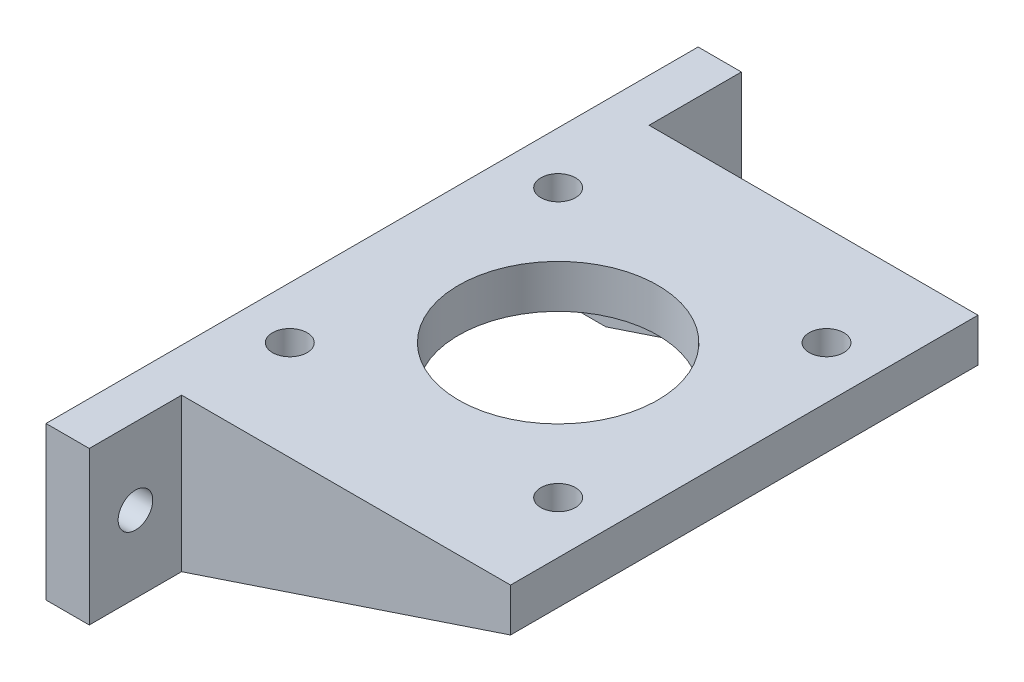
ISO-10303-21;
HEADER;
FILE_DESCRIPTION(('STEP AP214'),'2;1');
FILE_NAME('part.step','',(''),(''),'','','');
FILE_SCHEMA(('AUTOMOTIVE_DESIGN { 1 0 10303 214 1 1 1 1 }'));
ENDSEC;
DATA;
#1=APPLICATION_CONTEXT('core data for automotive mechanical design processes');
#2=APPLICATION_PROTOCOL_DEFINITION('international standard','automotive_design',2000,#1);
#3=PRODUCT_CONTEXT('',#1,'mechanical');
#4=PRODUCT('Part','Part','',(#3));
#5=PRODUCT_RELATED_PRODUCT_CATEGORY('part','',(#4));
#6=PRODUCT_DEFINITION_FORMATION('','',#4);
#7=PRODUCT_DEFINITION_CONTEXT('part definition',#1,'design');
#8=PRODUCT_DEFINITION('design','',#6,#7);
#9=PRODUCT_DEFINITION_SHAPE('','',#8);
#10=(LENGTH_UNIT() NAMED_UNIT(*) SI_UNIT(.MILLI.,.METRE.));
#11=(NAMED_UNIT(*) PLANE_ANGLE_UNIT() SI_UNIT($,.RADIAN.));
#12=(NAMED_UNIT(*) SI_UNIT($,.STERADIAN.) SOLID_ANGLE_UNIT());
#13=UNCERTAINTY_MEASURE_WITH_UNIT(LENGTH_MEASURE(1.E-05),#10,'distance_accuracy_value','');
#14=(GEOMETRIC_REPRESENTATION_CONTEXT(3) GLOBAL_UNCERTAINTY_ASSIGNED_CONTEXT((#13)) GLOBAL_UNIT_ASSIGNED_CONTEXT((#10,
#11,#12)) REPRESENTATION_CONTEXT('',''));
#15=CARTESIAN_POINT('',(0.,0.,0.));
#16=DIRECTION('',(0.,0.,1.));
#17=DIRECTION('',(1.,0.,0.));
#18=AXIS2_PLACEMENT_3D('',#15,#16,#17);
#19=CARTESIAN_POINT('',(0.,0.,5.));
#20=DIRECTION('',(0.,0.,1.));
#21=DIRECTION('',(1.,0.,0.));
#22=AXIS2_PLACEMENT_3D('',#19,#20,#21);
#23=PLANE('',#22);
#24=DIRECTION('',(1.,0.,0.));
#25=VECTOR('',#24,1.);
#26=CARTESIAN_POINT('',(0.,5.,5.));
#27=LINE('',#26,#25);
#28=CARTESIAN_POINT('',(5.,5.,5.));
#29=VERTEX_POINT('',#28);
#30=CARTESIAN_POINT('',(43.,5.,5.));
#31=VERTEX_POINT('',#30);
#32=EDGE_CURVE('E209',#29,#31,#27,.T.);
#33=ORIENTED_EDGE('',*,*,#32,.F.);
#34=DIRECTION('',(0.,-1.,0.));
#35=VECTOR('',#34,1.);
#36=CARTESIAN_POINT('',(5.,5.,5.));
#37=LINE('',#36,#35);
#38=CARTESIAN_POINT('',(5.,-12.666,5.));
#39=VERTEX_POINT('',#38);
#40=EDGE_CURVE('E172',#29,#39,#37,.T.);
#41=ORIENTED_EDGE('',*,*,#40,.T.);
#42=DIRECTION('',(0.948688291028524,0.316212786688613,0.));
#43=VECTOR('',#42,1.);
#44=CARTESIAN_POINT('',(4.29959263801126,-12.8994568328145,5.));
#45=LINE('',#44,#43);
#46=CARTESIAN_POINT('',(43.,0.,5.));
#47=VERTEX_POINT('',#46);
#48=EDGE_CURVE('E206',#39,#47,#45,.T.);
#49=ORIENTED_EDGE('',*,*,#48,.T.);
#50=DIRECTION('',(0.,-1.,0.));
#51=VECTOR('',#50,1.);
#52=CARTESIAN_POINT('',(43.,0.,5.));
#53=LINE('',#52,#51);
#54=EDGE_CURVE('E230',#31,#47,#53,.T.);
#55=ORIENTED_EDGE('',*,*,#54,.F.);
#56=EDGE_LOOP('',(#33,#41,#49,#55));
#57=FACE_BOUND('',#56,.T.);
#58=ADVANCED_FACE('F35',(#57),#23,.T.);
#59=CARTESIAN_POINT('',(0.,0.,-44.));
#60=DIRECTION('',(0.,-1.,0.));
#61=DIRECTION('',(0.,0.,-1.));
#62=AXIS2_PLACEMENT_3D('',#59,#60,#61);
#63=PLANE('',#62);
#64=CARTESIAN_POINT('',(37.0000000000003,0.,-6.5));
#65=DIRECTION('',(0.,1.,0.));
#66=DIRECTION('',(0.,0.,1.));
#67=AXIS2_PLACEMENT_3D('',#64,#65,#66);
#68=CIRCLE('',#67,2.);
#69=CARTESIAN_POINT('',(37.0000000000003,0.,-4.5));
#70=VERTEX_POINT('',#69);
#71=EDGE_CURVE('E250',#70,#70,#68,.T.);
#72=ORIENTED_EDGE('',*,*,#71,.T.);
#73=EDGE_LOOP('',(#72));
#74=FACE_BOUND('',#73,.T.);
#75=CARTESIAN_POINT('',(6.00000000000032,0.,-6.49999999999978));
#76=DIRECTION('',(0.,1.,0.));
#77=DIRECTION('',(0.,0.,1.));
#78=AXIS2_PLACEMENT_3D('',#75,#76,#77);
#79=CIRCLE('',#78,2.);
#80=CARTESIAN_POINT('',(6.00000000000032,0.,-4.49999999999978));
#81=VERTEX_POINT('',#80);
#82=EDGE_CURVE('E257',#81,#81,#79,.T.);
#83=ORIENTED_EDGE('',*,*,#82,.T.);
#84=EDGE_LOOP('',(#83));
#85=FACE_BOUND('',#84,.T.);
#86=CARTESIAN_POINT('',(6.,0.,-37.4999999999998));
#87=DIRECTION('',(0.,1.,0.));
#88=DIRECTION('',(0.,0.,1.));
#89=AXIS2_PLACEMENT_3D('',#86,#87,#88);
#90=CIRCLE('',#89,2.);
#91=CARTESIAN_POINT('',(6.,0.,-35.4999999999998));
#92=VERTEX_POINT('',#91);
#93=EDGE_CURVE('E263',#92,#92,#90,.T.);
#94=ORIENTED_EDGE('',*,*,#93,.T.);
#95=EDGE_LOOP('',(#94));
#96=FACE_BOUND('',#95,.T.);
#97=CARTESIAN_POINT('',(37.,0.,-37.5));
#98=DIRECTION('',(0.,1.,0.));
#99=DIRECTION('',(0.,0.,1.));
#100=AXIS2_PLACEMENT_3D('',#97,#98,#99);
#101=CIRCLE('',#100,2.);
#102=CARTESIAN_POINT('',(37.,0.,-35.5));
#103=VERTEX_POINT('',#102);
#104=EDGE_CURVE('E269',#103,#103,#101,.T.);
#105=ORIENTED_EDGE('',*,*,#104,.T.);
#106=EDGE_LOOP('',(#105));
#107=FACE_BOUND('',#106,.T.);
#108=CARTESIAN_POINT('',(21.5,0.,-22.));
#109=DIRECTION('',(0.,1.,0.));
#110=DIRECTION('',(0.,0.,1.));
#111=AXIS2_PLACEMENT_3D('',#108,#109,#110);
#112=CIRCLE('',#111,11.5);
#113=CARTESIAN_POINT('',(21.5,0.,-10.5));
#114=VERTEX_POINT('',#113);
#115=EDGE_CURVE('E275',#114,#114,#112,.T.);
#116=ORIENTED_EDGE('',*,*,#115,.T.);
#117=EDGE_LOOP('',(#116));
#118=FACE_BOUND('',#117,.T.);
#119=DIRECTION('',(1.,0.,0.));
#120=VECTOR('',#119,1.);
#121=CARTESIAN_POINT('',(0.,0.,0.));
#122=LINE('',#121,#120);
#123=CARTESIAN_POINT('',(0.,0.,0.));
#124=VERTEX_POINT('',#123);
#125=CARTESIAN_POINT('',(43.,0.,0.));
#126=VERTEX_POINT('',#125);
#127=EDGE_CURVE('E278',#124,#126,#122,.T.);
#128=ORIENTED_EDGE('',*,*,#127,.F.);
#129=DIRECTION('',(0.,0.,1.));
#130=VECTOR('',#129,1.);
#131=CARTESIAN_POINT('',(0.,0.,-44.));
#132=LINE('',#131,#130);
#133=CARTESIAN_POINT('',(0.,0.,-44.));
#134=VERTEX_POINT('',#133);
#135=EDGE_CURVE('E11',#134,#124,#132,.T.);
#136=ORIENTED_EDGE('',*,*,#135,.F.);
#137=DIRECTION('',(1.,0.,0.));
#138=VECTOR('',#137,1.);
#139=CARTESIAN_POINT('',(0.,0.,-44.));
#140=LINE('',#139,#138);
#141=CARTESIAN_POINT('',(43.,0.,-44.));
#142=VERTEX_POINT('',#141);
#143=EDGE_CURVE('E285',#134,#142,#140,.T.);
#144=ORIENTED_EDGE('',*,*,#143,.T.);
#145=DIRECTION('',(0.,0.,1.));
#146=VECTOR('',#145,1.);
#147=CARTESIAN_POINT('',(43.,0.,-44.));
#148=LINE('',#147,#146);
#149=EDGE_CURVE('E284',#142,#126,#148,.T.);
#150=ORIENTED_EDGE('',*,*,#149,.T.);
#151=EDGE_LOOP('',(#128,#136,#144,#150));
#152=FACE_BOUND('',#151,.T.);
#153=ADVANCED_FACE('F37',(#74,#85,#96,#107,#118,#152),#63,.T.);
#154=CARTESIAN_POINT('',(0.,0.,-44.));
#155=DIRECTION('',(1.,0.,0.));
#156=DIRECTION('',(0.,0.,-1.));
#157=AXIS2_PLACEMENT_3D('',#154,#155,#156);
#158=PLANE('',#157);
#159=ORIENTED_EDGE('',*,*,#135,.T.);
#160=DIRECTION('',(0.,1.,0.));
#161=VECTOR('',#160,1.);
#162=CARTESIAN_POINT('',(0.,0.,0.));
#163=LINE('',#162,#161);
#164=CARTESIAN_POINT('',(0.,-12.666,0.));
#165=VERTEX_POINT('',#164);
#166=EDGE_CURVE('E244',#165,#124,#163,.T.);
#167=ORIENTED_EDGE('',*,*,#166,.F.);
#168=DIRECTION('',(0.,0.,-1.));
#169=VECTOR('',#168,1.);
#170=CARTESIAN_POINT('',(0.,-12.666,5.));
#171=LINE('',#170,#169);
#172=CARTESIAN_POINT('',(0.,-12.666,15.666));
#173=VERTEX_POINT('',#172);
#174=EDGE_CURVE('E248',#173,#165,#171,.T.);
#175=ORIENTED_EDGE('',*,*,#174,.F.);
#176=DIRECTION('',(0.,1.,0.));
#177=VECTOR('',#176,1.);
#178=CARTESIAN_POINT('',(0.,5.00000000000001,15.666));
#179=LINE('',#178,#177);
#180=CARTESIAN_POINT('',(0.,5.00000000000001,15.666));
#181=VERTEX_POINT('',#180);
#182=EDGE_CURVE('E165',#173,#181,#179,.T.);
#183=ORIENTED_EDGE('',*,*,#182,.T.);
#184=DIRECTION('',(0.,0.,1.));
#185=VECTOR('',#184,1.);
#186=CARTESIAN_POINT('',(0.,5.,-44.));
#187=LINE('',#186,#185);
#188=CARTESIAN_POINT('',(0.,5.,-59.666));
#189=VERTEX_POINT('',#188);
#190=EDGE_CURVE('E44',#189,#181,#187,.T.);
#191=ORIENTED_EDGE('',*,*,#190,.F.);
#192=DIRECTION('',(0.,-1.,0.));
#193=VECTOR('',#192,1.);
#194=CARTESIAN_POINT('',(0.,5.,-59.666));
#195=LINE('',#194,#193);
#196=CARTESIAN_POINT('',(0.,-12.666,-59.666));
#197=VERTEX_POINT('',#196);
#198=EDGE_CURVE('E134',#189,#197,#195,.T.);
#199=ORIENTED_EDGE('',*,*,#198,.T.);
#200=DIRECTION('',(0.,0.,1.));
#201=VECTOR('',#200,1.);
#202=CARTESIAN_POINT('',(0.,-12.666,-49.));
#203=LINE('',#202,#201);
#204=CARTESIAN_POINT('',(0.,-12.666,-44.));
#205=VERTEX_POINT('',#204);
#206=EDGE_CURVE('E197',#197,#205,#203,.T.);
#207=ORIENTED_EDGE('',*,*,#206,.T.);
#208=DIRECTION('',(0.,1.,0.));
#209=VECTOR('',#208,1.);
#210=CARTESIAN_POINT('',(0.,0.,-44.));
#211=LINE('',#210,#209);
#212=EDGE_CURVE('E189',#205,#134,#211,.T.);
#213=ORIENTED_EDGE('',*,*,#212,.T.);
#214=EDGE_LOOP('',(#159,#167,#175,#183,#191,#199,#207,#213));
#215=FACE_BOUND('',#214,.T.);
#216=CARTESIAN_POINT('',(0.,-3.833,10.333));
#217=DIRECTION('',(-1.,0.,0.));
#218=DIRECTION('',(0.,0.,1.));
#219=AXIS2_PLACEMENT_3D('',#216,#217,#218);
#220=CIRCLE('',#219,2.);
#221=CARTESIAN_POINT('',(0.,-3.833,12.333));
#222=VERTEX_POINT('',#221);
#223=EDGE_CURVE('E160',#222,#222,#220,.T.);
#224=ORIENTED_EDGE('',*,*,#223,.F.);
#225=EDGE_LOOP('',(#224));
#226=FACE_BOUND('',#225,.T.);
#227=CARTESIAN_POINT('',(0.,-3.83300000000001,-54.333));
#228=DIRECTION('',(-1.,0.,0.));
#229=DIRECTION('',(0.,0.,-1.));
#230=AXIS2_PLACEMENT_3D('',#227,#228,#229);
#231=CIRCLE('',#230,2.);
#232=CARTESIAN_POINT('',(0.,-3.83300000000001,-56.333));
#233=VERTEX_POINT('',#232);
#234=EDGE_CURVE('E154',#233,#233,#231,.T.);
#235=ORIENTED_EDGE('',*,*,#234,.F.);
#236=EDGE_LOOP('',(#235));
#237=FACE_BOUND('',#236,.T.);
#238=ADVANCED_FACE('F300',(#215,#226,#237),#158,.F.);
#239=CARTESIAN_POINT('',(0.,5.,-44.));
#240=DIRECTION('',(0.,-1.,0.));
#241=DIRECTION('',(0.,0.,-1.));
#242=AXIS2_PLACEMENT_3D('',#239,#240,#241);
#243=PLANE('',#242);
#244=CARTESIAN_POINT('',(37.0000000000003,5.,-6.5));
#245=DIRECTION('',(0.,1.,0.));
#246=DIRECTION('',(0.,0.,1.));
#247=AXIS2_PLACEMENT_3D('',#244,#245,#246);
#248=CIRCLE('',#247,2.);
#249=CARTESIAN_POINT('',(37.0000000000003,5.,-4.5));
#250=VERTEX_POINT('',#249);
#251=EDGE_CURVE('E254',#250,#250,#248,.T.);
#252=ORIENTED_EDGE('',*,*,#251,.F.);
#253=EDGE_LOOP('',(#252));
#254=FACE_BOUND('',#253,.T.);
#255=CARTESIAN_POINT('',(6.00000000000032,5.,-6.49999999999978));
#256=DIRECTION('',(0.,1.,0.));
#257=DIRECTION('',(0.,0.,1.));
#258=AXIS2_PLACEMENT_3D('',#255,#256,#257);
#259=CIRCLE('',#258,2.);
#260=CARTESIAN_POINT('',(6.00000000000032,5.,-4.49999999999978));
#261=VERTEX_POINT('',#260);
#262=EDGE_CURVE('E253',#261,#261,#259,.T.);
#263=ORIENTED_EDGE('',*,*,#262,.F.);
#264=EDGE_LOOP('',(#263));
#265=FACE_BOUND('',#264,.T.);
#266=CARTESIAN_POINT('',(6.,5.,-37.4999999999998));
#267=DIRECTION('',(0.,1.,0.));
#268=DIRECTION('',(0.,0.,1.));
#269=AXIS2_PLACEMENT_3D('',#266,#267,#268);
#270=CIRCLE('',#269,2.);
#271=CARTESIAN_POINT('',(6.,5.,-35.4999999999998));
#272=VERTEX_POINT('',#271);
#273=EDGE_CURVE('E260',#272,#272,#270,.T.);
#274=ORIENTED_EDGE('',*,*,#273,.F.);
#275=EDGE_LOOP('',(#274));
#276=FACE_BOUND('',#275,.T.);
#277=CARTESIAN_POINT('',(37.,5.,-37.5));
#278=DIRECTION('',(0.,1.,0.));
#279=DIRECTION('',(0.,0.,1.));
#280=AXIS2_PLACEMENT_3D('',#277,#278,#279);
#281=CIRCLE('',#280,2.);
#282=CARTESIAN_POINT('',(37.,5.,-35.5));
#283=VERTEX_POINT('',#282);
#284=EDGE_CURVE('E266',#283,#283,#281,.T.);
#285=ORIENTED_EDGE('',*,*,#284,.F.);
#286=EDGE_LOOP('',(#285));
#287=FACE_BOUND('',#286,.T.);
#288=CARTESIAN_POINT('',(21.5,5.,-22.));
#289=DIRECTION('',(0.,1.,0.));
#290=DIRECTION('',(0.,0.,1.));
#291=AXIS2_PLACEMENT_3D('',#288,#289,#290);
#292=CIRCLE('',#291,11.5);
#293=CARTESIAN_POINT('',(21.5,5.,-10.5));
#294=VERTEX_POINT('',#293);
#295=EDGE_CURVE('E272',#294,#294,#292,.T.);
#296=ORIENTED_EDGE('',*,*,#295,.F.);
#297=EDGE_LOOP('',(#296));
#298=FACE_BOUND('',#297,.T.);
#299=ORIENTED_EDGE('',*,*,#190,.T.);
#300=DIRECTION('',(-1.,0.,0.));
#301=VECTOR('',#300,1.);
#302=CARTESIAN_POINT('',(5.,5.00000000000001,15.666));
#303=LINE('',#302,#301);
#304=CARTESIAN_POINT('',(5.,5.00000000000001,15.666));
#305=VERTEX_POINT('',#304);
#306=EDGE_CURVE('E178',#305,#181,#303,.T.);
#307=ORIENTED_EDGE('',*,*,#306,.F.);
#308=DIRECTION('',(0.,0.,-1.));
#309=VECTOR('',#308,1.);
#310=CARTESIAN_POINT('',(5.,5.,5.));
#311=LINE('',#310,#309);
#312=EDGE_CURVE('E175',#305,#29,#311,.T.);
#313=ORIENTED_EDGE('',*,*,#312,.T.);
#314=ORIENTED_EDGE('',*,*,#32,.T.);
#315=DIRECTION('',(0.,0.,1.));
#316=VECTOR('',#315,1.);
#317=CARTESIAN_POINT('',(43.,5.,-44.));
#318=LINE('',#317,#316);
#319=CARTESIAN_POINT('',(43.,5.,-49.));
#320=VERTEX_POINT('',#319);
#321=EDGE_CURVE('E282',#320,#31,#318,.T.);
#322=ORIENTED_EDGE('',*,*,#321,.F.);
#323=DIRECTION('',(1.,0.,0.));
#324=VECTOR('',#323,1.);
#325=CARTESIAN_POINT('',(0.,5.,-49.));
#326=LINE('',#325,#324);
#327=CARTESIAN_POINT('',(5.,5.,-49.));
#328=VERTEX_POINT('',#327);
#329=EDGE_CURVE('E145',#328,#320,#326,.T.);
#330=ORIENTED_EDGE('',*,*,#329,.F.);
#331=DIRECTION('',(0.,0.,-1.));
#332=VECTOR('',#331,1.);
#333=CARTESIAN_POINT('',(5.,5.,-49.));
#334=LINE('',#333,#332);
#335=CARTESIAN_POINT('',(5.,5.,-59.666));
#336=VERTEX_POINT('',#335);
#337=EDGE_CURVE('E52',#328,#336,#334,.T.);
#338=ORIENTED_EDGE('',*,*,#337,.T.);
#339=DIRECTION('',(-1.,0.,0.));
#340=VECTOR('',#339,1.);
#341=CARTESIAN_POINT('',(5.,5.,-59.666));
#342=LINE('',#341,#340);
#343=EDGE_CURVE('E128',#336,#189,#342,.T.);
#344=ORIENTED_EDGE('',*,*,#343,.T.);
#345=EDGE_LOOP('',(#299,#307,#313,#314,#322,#330,#338,#344));
#346=FACE_BOUND('',#345,.T.);
#347=ADVANCED_FACE('F143',(#254,#265,#276,#287,#298,#346),#243,.F.);
#348=CARTESIAN_POINT('',(43.,0.,-44.));
#349=DIRECTION('',(-1.,0.,0.));
#350=DIRECTION('',(0.,0.,1.));
#351=AXIS2_PLACEMENT_3D('',#348,#349,#350);
#352=PLANE('',#351);
#353=ORIENTED_EDGE('',*,*,#321,.T.);
#354=ORIENTED_EDGE('',*,*,#54,.T.);
#355=DIRECTION('',(0.,0.,-1.));
#356=VECTOR('',#355,1.);
#357=CARTESIAN_POINT('',(43.,0.,5.));
#358=LINE('',#357,#356);
#359=EDGE_CURVE('E235',#47,#126,#358,.T.);
#360=ORIENTED_EDGE('',*,*,#359,.T.);
#361=ORIENTED_EDGE('',*,*,#149,.F.);
#362=DIRECTION('',(0.,0.,1.));
#363=VECTOR('',#362,1.);
#364=CARTESIAN_POINT('',(43.,0.,-49.));
#365=LINE('',#364,#363);
#366=CARTESIAN_POINT('',(43.,0.,-49.));
#367=VERTEX_POINT('',#366);
#368=EDGE_CURVE('E304',#367,#142,#365,.T.);
#369=ORIENTED_EDGE('',*,*,#368,.F.);
#370=DIRECTION('',(0.,-1.,0.));
#371=VECTOR('',#370,1.);
#372=CARTESIAN_POINT('',(43.,0.,-49.));
#373=LINE('',#372,#371);
#374=EDGE_CURVE('E188',#320,#367,#373,.T.);
#375=ORIENTED_EDGE('',*,*,#374,.F.);
#376=EDGE_LOOP('',(#353,#354,#360,#361,#369,#375));
#377=FACE_BOUND('',#376,.T.);
#378=ADVANCED_FACE('F312',(#377),#352,.F.);
#379=CARTESIAN_POINT('',(21.5,0.,-22.));
#380=DIRECTION('',(0.,1.,0.));
#381=DIRECTION('',(0.,0.,1.));
#382=AXIS2_PLACEMENT_3D('',#379,#380,#381);
#383=CYLINDRICAL_SURFACE('',#382,11.5);
#384=ORIENTED_EDGE('',*,*,#115,.F.);
#385=EDGE_LOOP('',(#384));
#386=FACE_BOUND('',#385,.T.);
#387=ORIENTED_EDGE('',*,*,#295,.T.);
#388=EDGE_LOOP('',(#387));
#389=FACE_BOUND('',#388,.T.);
#390=ADVANCED_FACE('F389',(#386,#389),#383,.F.);
#391=CARTESIAN_POINT('',(37.,0.,-37.5));
#392=DIRECTION('',(0.,1.,0.));
#393=DIRECTION('',(0.,0.,1.));
#394=AXIS2_PLACEMENT_3D('',#391,#392,#393);
#395=CYLINDRICAL_SURFACE('',#394,2.);
#396=ORIENTED_EDGE('',*,*,#104,.F.);
#397=EDGE_LOOP('',(#396));
#398=FACE_BOUND('',#397,.T.);
#399=ORIENTED_EDGE('',*,*,#284,.T.);
#400=EDGE_LOOP('',(#399));
#401=FACE_BOUND('',#400,.T.);
#402=ADVANCED_FACE('F395',(#398,#401),#395,.F.);
#403=CARTESIAN_POINT('',(6.,0.,-37.4999999999998));
#404=DIRECTION('',(0.,1.,0.));
#405=DIRECTION('',(0.,0.,1.));
#406=AXIS2_PLACEMENT_3D('',#403,#404,#405);
#407=CYLINDRICAL_SURFACE('',#406,2.);
#408=ORIENTED_EDGE('',*,*,#93,.F.);
#409=EDGE_LOOP('',(#408));
#410=FACE_BOUND('',#409,.T.);
#411=ORIENTED_EDGE('',*,*,#273,.T.);
#412=EDGE_LOOP('',(#411));
#413=FACE_BOUND('',#412,.T.);
#414=ADVANCED_FACE('F400',(#410,#413),#407,.F.);
#415=CARTESIAN_POINT('',(6.00000000000032,0.,-6.49999999999978));
#416=DIRECTION('',(0.,1.,0.));
#417=DIRECTION('',(0.,0.,1.));
#418=AXIS2_PLACEMENT_3D('',#415,#416,#417);
#419=CYLINDRICAL_SURFACE('',#418,2.);
#420=ORIENTED_EDGE('',*,*,#82,.F.);
#421=EDGE_LOOP('',(#420));
#422=FACE_BOUND('',#421,.T.);
#423=ORIENTED_EDGE('',*,*,#262,.T.);
#424=EDGE_LOOP('',(#423));
#425=FACE_BOUND('',#424,.T.);
#426=ADVANCED_FACE('F332',(#422,#425),#419,.F.);
#427=CARTESIAN_POINT('',(37.0000000000003,0.,-6.5));
#428=DIRECTION('',(0.,1.,0.));
#429=DIRECTION('',(0.,0.,1.));
#430=AXIS2_PLACEMENT_3D('',#427,#428,#429);
#431=CYLINDRICAL_SURFACE('',#430,2.);
#432=ORIENTED_EDGE('',*,*,#71,.F.);
#433=EDGE_LOOP('',(#432));
#434=FACE_BOUND('',#433,.T.);
#435=ORIENTED_EDGE('',*,*,#251,.T.);
#436=EDGE_LOOP('',(#435));
#437=FACE_BOUND('',#436,.T.);
#438=ADVANCED_FACE('F325',(#434,#437),#431,.F.);
#439=CARTESIAN_POINT('',(0.,0.,0.));
#440=DIRECTION('',(0.,0.,1.));
#441=DIRECTION('',(1.,0.,0.));
#442=AXIS2_PLACEMENT_3D('',#439,#440,#441);
#443=PLANE('',#442);
#444=ORIENTED_EDGE('',*,*,#166,.T.);
#445=ORIENTED_EDGE('',*,*,#127,.T.);
#446=DIRECTION('',(0.948688291028524,0.316212786688613,0.));
#447=VECTOR('',#446,1.);
#448=CARTESIAN_POINT('',(4.29959263801126,-12.8994568328145,0.));
#449=LINE('',#448,#447);
#450=CARTESIAN_POINT('',(5.,-12.666,0.));
#451=VERTEX_POINT('',#450);
#452=EDGE_CURVE('E212',#451,#126,#449,.T.);
#453=ORIENTED_EDGE('',*,*,#452,.F.);
#454=DIRECTION('',(-1.,0.,0.));
#455=VECTOR('',#454,1.);
#456=CARTESIAN_POINT('',(0.,-12.666,0.));
#457=LINE('',#456,#455);
#458=EDGE_CURVE('E241',#451,#165,#457,.T.);
#459=ORIENTED_EDGE('',*,*,#458,.T.);
#460=EDGE_LOOP('',(#444,#445,#453,#459));
#461=FACE_BOUND('',#460,.T.);
#462=ADVANCED_FACE('F323',(#461),#443,.F.);
#463=CARTESIAN_POINT('',(0.,-12.666,5.));
#464=DIRECTION('',(0.,-1.,0.));
#465=DIRECTION('',(0.,0.,-1.));
#466=AXIS2_PLACEMENT_3D('',#463,#464,#465);
#467=PLANE('',#466);
#468=ORIENTED_EDGE('',*,*,#458,.F.);
#469=DIRECTION('',(0.,0.,-1.));
#470=VECTOR('',#469,1.);
#471=CARTESIAN_POINT('',(5.,-12.666,5.));
#472=LINE('',#471,#470);
#473=EDGE_CURVE('E236',#39,#451,#472,.T.);
#474=ORIENTED_EDGE('',*,*,#473,.F.);
#475=DIRECTION('',(0.,0.,1.));
#476=VECTOR('',#475,1.);
#477=CARTESIAN_POINT('',(5.,-12.666,5.));
#478=LINE('',#477,#476);
#479=CARTESIAN_POINT('',(5.,-12.666,15.666));
#480=VERTEX_POINT('',#479);
#481=EDGE_CURVE('E168',#39,#480,#478,.T.);
#482=ORIENTED_EDGE('',*,*,#481,.T.);
#483=DIRECTION('',(-1.,0.,0.));
#484=VECTOR('',#483,1.);
#485=CARTESIAN_POINT('',(5.,-12.666,15.666));
#486=LINE('',#485,#484);
#487=EDGE_CURVE('E182',#480,#173,#486,.T.);
#488=ORIENTED_EDGE('',*,*,#487,.T.);
#489=ORIENTED_EDGE('',*,*,#174,.T.);
#490=EDGE_LOOP('',(#468,#474,#482,#488,#489));
#491=FACE_BOUND('',#490,.T.);
#492=ADVANCED_FACE('F321',(#491),#467,.T.);
#493=CARTESIAN_POINT('',(4.29959263801126,-12.8994568328145,5.));
#494=DIRECTION('',(-0.316212786688613,0.948688291028524,0.));
#495=DIRECTION('',(-0.948688291028524,-0.316212786688613,0.));
#496=AXIS2_PLACEMENT_3D('',#493,#494,#495);
#497=PLANE('',#496);
#498=ORIENTED_EDGE('',*,*,#452,.T.);
#499=ORIENTED_EDGE('',*,*,#359,.F.);
#500=ORIENTED_EDGE('',*,*,#48,.F.);
#501=ORIENTED_EDGE('',*,*,#473,.T.);
#502=EDGE_LOOP('',(#498,#499,#500,#501));
#503=FACE_BOUND('',#502,.T.);
#504=ADVANCED_FACE('F316',(#503),#497,.F.);
#505=CARTESIAN_POINT('',(0.,0.,-44.));
#506=DIRECTION('',(0.,0.,1.));
#507=DIRECTION('',(1.,0.,0.));
#508=AXIS2_PLACEMENT_3D('',#505,#506,#507);
#509=PLANE('',#508);
#510=ORIENTED_EDGE('',*,*,#143,.F.);
#511=ORIENTED_EDGE('',*,*,#212,.F.);
#512=DIRECTION('',(-1.,0.,0.));
#513=VECTOR('',#512,1.);
#514=CARTESIAN_POINT('',(0.,-12.666,-44.));
#515=LINE('',#514,#513);
#516=CARTESIAN_POINT('',(5.,-12.666,-44.));
#517=VERTEX_POINT('',#516);
#518=EDGE_CURVE('E181',#517,#205,#515,.T.);
#519=ORIENTED_EDGE('',*,*,#518,.F.);
#520=DIRECTION('',(0.948688291028524,0.316212786688613,0.));
#521=VECTOR('',#520,1.);
#522=CARTESIAN_POINT('',(4.29959263801126,-12.8994568328145,-44.));
#523=LINE('',#522,#521);
#524=EDGE_CURVE('E61',#517,#142,#523,.T.);
#525=ORIENTED_EDGE('',*,*,#524,.T.);
#526=EDGE_LOOP('',(#510,#511,#519,#525));
#527=FACE_BOUND('',#526,.T.);
#528=ADVANCED_FACE('F297',(#527),#509,.T.);
#529=CARTESIAN_POINT('',(0.,-12.666,-49.));
#530=DIRECTION('',(0.,1.,0.));
#531=DIRECTION('',(0.,0.,1.));
#532=AXIS2_PLACEMENT_3D('',#529,#530,#531);
#533=PLANE('',#532);
#534=ORIENTED_EDGE('',*,*,#518,.T.);
#535=ORIENTED_EDGE('',*,*,#206,.F.);
#536=DIRECTION('',(-1.,0.,0.));
#537=VECTOR('',#536,1.);
#538=CARTESIAN_POINT('',(5.,-12.666,-59.666));
#539=LINE('',#538,#537);
#540=CARTESIAN_POINT('',(5.,-12.666,-59.666));
#541=VERTEX_POINT('',#540);
#542=EDGE_CURVE('E136',#541,#197,#539,.T.);
#543=ORIENTED_EDGE('',*,*,#542,.F.);
#544=DIRECTION('',(0.,0.,1.));
#545=VECTOR('',#544,1.);
#546=CARTESIAN_POINT('',(5.,-12.666,-49.));
#547=LINE('',#546,#545);
#548=CARTESIAN_POINT('',(5.,-12.666,-49.));
#549=VERTEX_POINT('',#548);
#550=EDGE_CURVE('E137',#541,#549,#547,.T.);
#551=ORIENTED_EDGE('',*,*,#550,.T.);
#552=DIRECTION('',(0.,0.,1.));
#553=VECTOR('',#552,1.);
#554=CARTESIAN_POINT('',(5.,-12.666,-49.));
#555=LINE('',#554,#553);
#556=EDGE_CURVE('E203',#549,#517,#555,.T.);
#557=ORIENTED_EDGE('',*,*,#556,.T.);
#558=EDGE_LOOP('',(#534,#535,#543,#551,#557));
#559=FACE_BOUND('',#558,.T.);
#560=ADVANCED_FACE('F305',(#559),#533,.F.);
#561=CARTESIAN_POINT('',(4.29959263801126,-12.8994568328145,-49.));
#562=DIRECTION('',(0.316212786688613,-0.948688291028524,0.));
#563=DIRECTION('',(0.948688291028524,0.316212786688613,0.));
#564=AXIS2_PLACEMENT_3D('',#561,#562,#563);
#565=PLANE('',#564);
#566=ORIENTED_EDGE('',*,*,#524,.F.);
#567=ORIENTED_EDGE('',*,*,#556,.F.);
#568=DIRECTION('',(0.948688291028524,0.316212786688613,0.));
#569=VECTOR('',#568,1.);
#570=CARTESIAN_POINT('',(4.29959263801126,-12.8994568328145,-49.));
#571=LINE('',#570,#569);
#572=EDGE_CURVE('E185',#549,#367,#571,.T.);
#573=ORIENTED_EDGE('',*,*,#572,.T.);
#574=ORIENTED_EDGE('',*,*,#368,.T.);
#575=EDGE_LOOP('',(#566,#567,#573,#574));
#576=FACE_BOUND('',#575,.T.);
#577=ADVANCED_FACE('F308',(#576),#565,.T.);
#578=CARTESIAN_POINT('',(0.,0.,-49.));
#579=DIRECTION('',(0.,0.,1.));
#580=DIRECTION('',(1.,0.,0.));
#581=AXIS2_PLACEMENT_3D('',#578,#579,#580);
#582=PLANE('',#581);
#583=ORIENTED_EDGE('',*,*,#572,.F.);
#584=DIRECTION('',(0.,1.,0.));
#585=VECTOR('',#584,1.);
#586=CARTESIAN_POINT('',(5.,5.,-49.));
#587=LINE('',#586,#585);
#588=EDGE_CURVE('E146',#549,#328,#587,.T.);
#589=ORIENTED_EDGE('',*,*,#588,.T.);
#590=ORIENTED_EDGE('',*,*,#329,.T.);
#591=ORIENTED_EDGE('',*,*,#374,.T.);
#592=EDGE_LOOP('',(#583,#589,#590,#591));
#593=FACE_BOUND('',#592,.T.);
#594=ADVANCED_FACE('F347',(#593),#582,.F.);
#595=CARTESIAN_POINT('',(5.,5.00000000000001,15.666));
#596=DIRECTION('',(0.,0.,1.));
#597=DIRECTION('',(0.,-1.,0.));
#598=AXIS2_PLACEMENT_3D('',#595,#596,#597);
#599=PLANE('',#598);
#600=ORIENTED_EDGE('',*,*,#182,.F.);
#601=ORIENTED_EDGE('',*,*,#487,.F.);
#602=DIRECTION('',(0.,1.,0.));
#603=VECTOR('',#602,1.);
#604=CARTESIAN_POINT('',(5.,5.00000000000001,15.666));
#605=LINE('',#604,#603);
#606=EDGE_CURVE('E171',#480,#305,#605,.T.);
#607=ORIENTED_EDGE('',*,*,#606,.T.);
#608=ORIENTED_EDGE('',*,*,#306,.T.);
#609=EDGE_LOOP('',(#600,#601,#607,#608));
#610=FACE_BOUND('',#609,.T.);
#611=ADVANCED_FACE('F352',(#610),#599,.T.);
#612=CARTESIAN_POINT('',(5.,0.,0.));
#613=DIRECTION('',(-1.,0.,0.));
#614=DIRECTION('',(0.,0.,1.));
#615=AXIS2_PLACEMENT_3D('',#612,#613,#614);
#616=PLANE('',#615);
#617=CARTESIAN_POINT('',(5.,-3.833,10.333));
#618=DIRECTION('',(-1.,0.,0.));
#619=DIRECTION('',(0.,0.,1.));
#620=AXIS2_PLACEMENT_3D('',#617,#618,#619);
#621=CIRCLE('',#620,2.);
#622=CARTESIAN_POINT('',(5.,-3.833,12.333));
#623=VERTEX_POINT('',#622);
#624=EDGE_CURVE('E162',#623,#623,#621,.T.);
#625=ORIENTED_EDGE('',*,*,#624,.T.);
#626=EDGE_LOOP('',(#625));
#627=FACE_BOUND('',#626,.T.);
#628=ORIENTED_EDGE('',*,*,#40,.F.);
#629=ORIENTED_EDGE('',*,*,#312,.F.);
#630=ORIENTED_EDGE('',*,*,#606,.F.);
#631=ORIENTED_EDGE('',*,*,#481,.F.);
#632=EDGE_LOOP('',(#628,#629,#630,#631));
#633=FACE_BOUND('',#632,.T.);
#634=ADVANCED_FACE('F356',(#627,#633),#616,.F.);
#635=CARTESIAN_POINT('',(5.,-3.833,10.333));
#636=DIRECTION('',(-1.,0.,0.));
#637=DIRECTION('',(0.,0.,1.));
#638=AXIS2_PLACEMENT_3D('',#635,#636,#637);
#639=CYLINDRICAL_SURFACE('',#638,2.);
#640=ORIENTED_EDGE('',*,*,#624,.F.);
#641=EDGE_LOOP('',(#640));
#642=FACE_BOUND('',#641,.T.);
#643=ORIENTED_EDGE('',*,*,#223,.T.);
#644=EDGE_LOOP('',(#643));
#645=FACE_BOUND('',#644,.T.);
#646=ADVANCED_FACE('F360',(#642,#645),#639,.F.);
#647=CARTESIAN_POINT('',(5.,5.,-59.666));
#648=DIRECTION('',(0.,0.,-1.));
#649=DIRECTION('',(-1.,0.,0.));
#650=AXIS2_PLACEMENT_3D('',#647,#648,#649);
#651=PLANE('',#650);
#652=ORIENTED_EDGE('',*,*,#198,.F.);
#653=ORIENTED_EDGE('',*,*,#343,.F.);
#654=DIRECTION('',(0.,-1.,0.));
#655=VECTOR('',#654,1.);
#656=CARTESIAN_POINT('',(5.,5.,-59.666));
#657=LINE('',#656,#655);
#658=EDGE_CURVE('E131',#336,#541,#657,.T.);
#659=ORIENTED_EDGE('',*,*,#658,.T.);
#660=ORIENTED_EDGE('',*,*,#542,.T.);
#661=EDGE_LOOP('',(#652,#653,#659,#660));
#662=FACE_BOUND('',#661,.T.);
#663=ADVANCED_FACE('F129',(#662),#651,.T.);
#664=CARTESIAN_POINT('',(5.,0.,0.));
#665=DIRECTION('',(1.,0.,0.));
#666=DIRECTION('',(0.,0.,-1.));
#667=AXIS2_PLACEMENT_3D('',#664,#665,#666);
#668=PLANE('',#667);
#669=CARTESIAN_POINT('',(5.,-3.83300000000001,-54.333));
#670=DIRECTION('',(-1.,0.,0.));
#671=DIRECTION('',(0.,0.,-1.));
#672=AXIS2_PLACEMENT_3D('',#669,#670,#671);
#673=CIRCLE('',#672,2.);
#674=CARTESIAN_POINT('',(5.,-3.83300000000001,-56.333));
#675=VERTEX_POINT('',#674);
#676=EDGE_CURVE('E159',#675,#675,#673,.T.);
#677=ORIENTED_EDGE('',*,*,#676,.T.);
#678=EDGE_LOOP('',(#677));
#679=FACE_BOUND('',#678,.T.);
#680=ORIENTED_EDGE('',*,*,#588,.F.);
#681=ORIENTED_EDGE('',*,*,#550,.F.);
#682=ORIENTED_EDGE('',*,*,#658,.F.);
#683=ORIENTED_EDGE('',*,*,#337,.F.);
#684=EDGE_LOOP('',(#680,#681,#682,#683));
#685=FACE_BOUND('',#684,.T.);
#686=ADVANCED_FACE('F139',(#679,#685),#668,.T.);
#687=CARTESIAN_POINT('',(5.,-3.83300000000001,-54.333));
#688=DIRECTION('',(-1.,0.,0.));
#689=DIRECTION('',(0.,0.,1.));
#690=AXIS2_PLACEMENT_3D('',#687,#688,#689);
#691=CYLINDRICAL_SURFACE('',#690,2.);
#692=ORIENTED_EDGE('',*,*,#676,.F.);
#693=EDGE_LOOP('',(#692));
#694=FACE_BOUND('',#693,.T.);
#695=ORIENTED_EDGE('',*,*,#234,.T.);
#696=EDGE_LOOP('',(#695));
#697=FACE_BOUND('',#696,.T.);
#698=ADVANCED_FACE('F369',(#694,#697),#691,.F.);
#699=CLOSED_SHELL('',(#58,#153,#238,#347,#378,#390,#402,#414,#426,#438,#462,#492,#504,#528,#560,
#577,#594,#611,#634,#646,#663,#686,#698));
#700=MANIFOLD_SOLID_BREP('B2',#699);
#701=ADVANCED_BREP_SHAPE_REPRESENTATION('',(#18,#700),#14);
#702=SHAPE_DEFINITION_REPRESENTATION(#9,#701);
ENDSEC;
END-ISO-10303-21;
